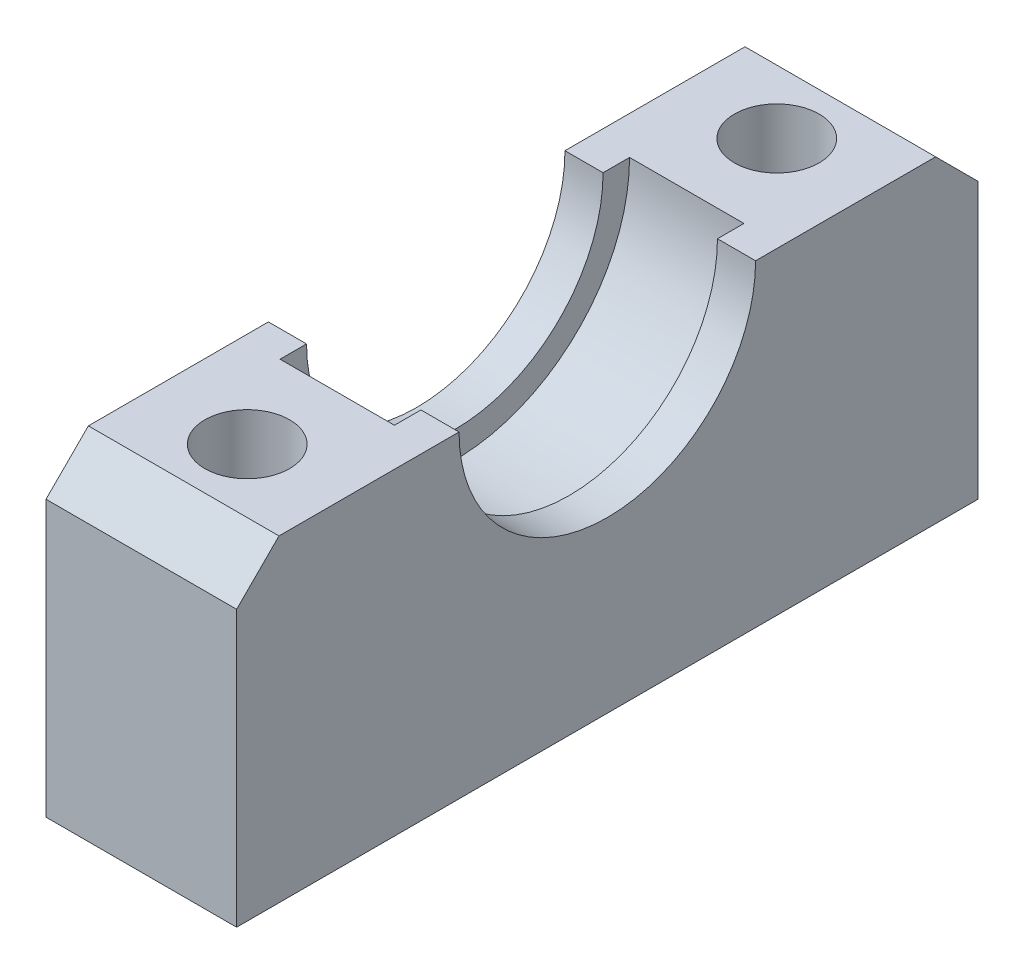
ISO-10303-21;
HEADER;
FILE_DESCRIPTION(('STEP AP214'),'2;1');
FILE_NAME('part.step','',(''),(''),'','','');
FILE_SCHEMA(('AUTOMOTIVE_DESIGN { 1 0 10303 214 1 1 1 1 }'));
ENDSEC;
DATA;
#1=APPLICATION_CONTEXT('core data for automotive mechanical design processes');
#2=APPLICATION_PROTOCOL_DEFINITION('international standard','automotive_design',2000,#1);
#3=PRODUCT_CONTEXT('',#1,'mechanical');
#4=PRODUCT('Part','Part','',(#3));
#5=PRODUCT_RELATED_PRODUCT_CATEGORY('part','',(#4));
#6=PRODUCT_DEFINITION_FORMATION('','',#4);
#7=PRODUCT_DEFINITION_CONTEXT('part definition',#1,'design');
#8=PRODUCT_DEFINITION('design','',#6,#7);
#9=PRODUCT_DEFINITION_SHAPE('','',#8);
#10=(LENGTH_UNIT() NAMED_UNIT(*) SI_UNIT(.MILLI.,.METRE.));
#11=(NAMED_UNIT(*) PLANE_ANGLE_UNIT() SI_UNIT($,.RADIAN.));
#12=(NAMED_UNIT(*) SI_UNIT($,.STERADIAN.) SOLID_ANGLE_UNIT());
#13=UNCERTAINTY_MEASURE_WITH_UNIT(LENGTH_MEASURE(1.E-05),#10,'distance_accuracy_value','');
#14=(GEOMETRIC_REPRESENTATION_CONTEXT(3) GLOBAL_UNCERTAINTY_ASSIGNED_CONTEXT((#13)) GLOBAL_UNIT_ASSIGNED_CONTEXT((#10,
#11,#12)) REPRESENTATION_CONTEXT('',''));
#15=CARTESIAN_POINT('',(0.,0.,0.));
#16=DIRECTION('',(0.,0.,1.));
#17=DIRECTION('',(1.,0.,0.));
#18=AXIS2_PLACEMENT_3D('',#15,#16,#17);
#19=CARTESIAN_POINT('',(-4.5,7.5,0.));
#20=DIRECTION('',(1.,0.,0.));
#21=DIRECTION('',(0.,0.,-1.));
#22=AXIS2_PLACEMENT_3D('',#19,#20,#21);
#23=CYLINDRICAL_SURFACE('',#22,7.);
#24=DIRECTION('',(1.,0.,0.));
#25=VECTOR('',#24,1.);
#26=CARTESIAN_POINT('',(-4.5,7.5,7.));
#27=LINE('',#26,#25);
#28=CARTESIAN_POINT('',(-4.5,7.5,7.));
#29=VERTEX_POINT('',#28);
#30=CARTESIAN_POINT('',(-2.7,7.5,7.));
#31=VERTEX_POINT('',#30);
#32=EDGE_CURVE('E222',#29,#31,#27,.T.);
#33=ORIENTED_EDGE('',*,*,#32,.T.);
#34=CARTESIAN_POINT('',(-2.7,7.5,0.));
#35=DIRECTION('',(1.,0.,0.));
#36=DIRECTION('',(0.,0.,-1.));
#37=AXIS2_PLACEMENT_3D('',#34,#35,#36);
#38=CIRCLE('',#37,7.);
#39=CARTESIAN_POINT('',(-2.7,7.5,-7.));
#40=VERTEX_POINT('',#39);
#41=EDGE_CURVE('E141',#31,#40,#38,.T.);
#42=ORIENTED_EDGE('',*,*,#41,.T.);
#43=DIRECTION('',(1.,0.,0.));
#44=VECTOR('',#43,1.);
#45=CARTESIAN_POINT('',(-4.5,7.5,-7.));
#46=LINE('',#45,#44);
#47=CARTESIAN_POINT('',(-4.5,7.5,-7.));
#48=VERTEX_POINT('',#47);
#49=EDGE_CURVE('E226',#48,#40,#46,.T.);
#50=ORIENTED_EDGE('',*,*,#49,.F.);
#51=CARTESIAN_POINT('',(-4.5,7.5,0.));
#52=DIRECTION('',(-1.,0.,0.));
#53=DIRECTION('',(0.,0.,-1.));
#54=AXIS2_PLACEMENT_3D('',#51,#52,#53);
#55=CIRCLE('',#54,7.);
#56=EDGE_CURVE('E199',#48,#29,#55,.T.);
#57=ORIENTED_EDGE('',*,*,#56,.T.);
#58=EDGE_LOOP('',(#33,#42,#50,#57));
#59=FACE_BOUND('',#58,.T.);
#60=ADVANCED_FACE('F45',(#59),#23,.F.);
#61=CARTESIAN_POINT('',(-4.5,-7.5,-17.5));
#62=DIRECTION('',(0.,0.,-1.));
#63=DIRECTION('',(-1.,0.,0.));
#64=AXIS2_PLACEMENT_3D('',#61,#62,#63);
#65=PLANE('',#64);
#66=DIRECTION('',(0.,1.,0.));
#67=VECTOR('',#66,1.);
#68=CARTESIAN_POINT('',(-4.5,-7.5,-17.5));
#69=LINE('',#68,#67);
#70=CARTESIAN_POINT('',(-4.5,-7.5,-17.5));
#71=VERTEX_POINT('',#70);
#72=CARTESIAN_POINT('',(-4.5,5.5,-17.5));
#73=VERTEX_POINT('',#72);
#74=EDGE_CURVE('E192',#71,#73,#69,.T.);
#75=ORIENTED_EDGE('',*,*,#74,.T.);
#76=DIRECTION('',(1.,0.,0.));
#77=VECTOR('',#76,1.);
#78=CARTESIAN_POINT('',(-4.5,5.5,-17.5));
#79=LINE('',#78,#77);
#80=CARTESIAN_POINT('',(4.5,5.5,-17.5));
#81=VERTEX_POINT('',#80);
#82=EDGE_CURVE('E237',#73,#81,#79,.T.);
#83=ORIENTED_EDGE('',*,*,#82,.T.);
#84=DIRECTION('',(0.,1.,0.));
#85=VECTOR('',#84,1.);
#86=CARTESIAN_POINT('',(4.5,-7.5,-17.5));
#87=LINE('',#86,#85);
#88=CARTESIAN_POINT('',(4.5,-7.5,-17.5));
#89=VERTEX_POINT('',#88);
#90=EDGE_CURVE('E165',#89,#81,#87,.T.);
#91=ORIENTED_EDGE('',*,*,#90,.F.);
#92=DIRECTION('',(1.,0.,0.));
#93=VECTOR('',#92,1.);
#94=CARTESIAN_POINT('',(-4.5,-7.5,-17.5));
#95=LINE('',#94,#93);
#96=EDGE_CURVE('E214',#71,#89,#95,.T.);
#97=ORIENTED_EDGE('',*,*,#96,.F.);
#98=EDGE_LOOP('',(#75,#83,#91,#97));
#99=FACE_BOUND('',#98,.T.);
#100=ADVANCED_FACE('F319',(#99),#65,.T.);
#101=CARTESIAN_POINT('',(-4.5,-7.5,17.5));
#102=DIRECTION('',(0.,-1.,0.));
#103=DIRECTION('',(0.,0.,-1.));
#104=AXIS2_PLACEMENT_3D('',#101,#102,#103);
#105=PLANE('',#104);
#106=CARTESIAN_POINT('',(0.,-7.5,-12.5));
#107=DIRECTION('',(0.,1.,0.));
#108=DIRECTION('',(0.,0.,1.));
#109=AXIS2_PLACEMENT_3D('',#106,#107,#108);
#110=CIRCLE('',#109,2.);
#111=CARTESIAN_POINT('',(0.,-7.5,-10.5));
#112=VERTEX_POINT('',#111);
#113=EDGE_CURVE('E158',#112,#112,#110,.T.);
#114=ORIENTED_EDGE('',*,*,#113,.T.);
#115=EDGE_LOOP('',(#114));
#116=FACE_BOUND('',#115,.T.);
#117=CARTESIAN_POINT('',(0.,-7.5,12.5));
#118=DIRECTION('',(0.,1.,0.));
#119=DIRECTION('',(0.,0.,1.));
#120=AXIS2_PLACEMENT_3D('',#117,#118,#119);
#121=CIRCLE('',#120,2.);
#122=CARTESIAN_POINT('',(0.,-7.5,14.5));
#123=VERTEX_POINT('',#122);
#124=EDGE_CURVE('E282',#123,#123,#121,.T.);
#125=ORIENTED_EDGE('',*,*,#124,.T.);
#126=EDGE_LOOP('',(#125));
#127=FACE_BOUND('',#126,.T.);
#128=ORIENTED_EDGE('',*,*,#96,.T.);
#129=DIRECTION('',(0.,0.,-1.));
#130=VECTOR('',#129,1.);
#131=CARTESIAN_POINT('',(4.5,-7.5,17.5));
#132=LINE('',#131,#130);
#133=CARTESIAN_POINT('',(4.5,-7.5,17.5));
#134=VERTEX_POINT('',#133);
#135=EDGE_CURVE('E188',#134,#89,#132,.T.);
#136=ORIENTED_EDGE('',*,*,#135,.F.);
#137=DIRECTION('',(1.,0.,0.));
#138=VECTOR('',#137,1.);
#139=CARTESIAN_POINT('',(-4.5,-7.5,17.5));
#140=LINE('',#139,#138);
#141=CARTESIAN_POINT('',(-4.5,-7.5,17.5));
#142=VERTEX_POINT('',#141);
#143=EDGE_CURVE('E218',#142,#134,#140,.T.);
#144=ORIENTED_EDGE('',*,*,#143,.F.);
#145=DIRECTION('',(0.,0.,-1.));
#146=VECTOR('',#145,1.);
#147=CARTESIAN_POINT('',(-4.5,-7.5,17.5));
#148=LINE('',#147,#146);
#149=EDGE_CURVE('E209',#142,#71,#148,.T.);
#150=ORIENTED_EDGE('',*,*,#149,.T.);
#151=EDGE_LOOP('',(#128,#136,#144,#150));
#152=FACE_BOUND('',#151,.T.);
#153=ADVANCED_FACE('F298',(#116,#127,#152),#105,.T.);
#154=CARTESIAN_POINT('',(-4.5,-7.5,17.5));
#155=DIRECTION('',(0.,0.,1.));
#156=DIRECTION('',(1.,0.,0.));
#157=AXIS2_PLACEMENT_3D('',#154,#155,#156);
#158=PLANE('',#157);
#159=DIRECTION('',(0.,-1.,0.));
#160=VECTOR('',#159,1.);
#161=CARTESIAN_POINT('',(4.5,-7.5,17.5));
#162=LINE('',#161,#160);
#163=CARTESIAN_POINT('',(4.5,5.49999999999999,17.5));
#164=VERTEX_POINT('',#163);
#165=EDGE_CURVE('E185',#164,#134,#162,.T.);
#166=ORIENTED_EDGE('',*,*,#165,.F.);
#167=DIRECTION('',(-1.,0.,0.));
#168=VECTOR('',#167,1.);
#169=CARTESIAN_POINT('',(-4.5,5.49999999999999,17.5));
#170=LINE('',#169,#168);
#171=CARTESIAN_POINT('',(-4.5,5.49999999999999,17.5));
#172=VERTEX_POINT('',#171);
#173=EDGE_CURVE('E11',#164,#172,#170,.T.);
#174=ORIENTED_EDGE('',*,*,#173,.T.);
#175=DIRECTION('',(0.,-1.,0.));
#176=VECTOR('',#175,1.);
#177=CARTESIAN_POINT('',(-4.5,-7.5,17.5));
#178=LINE('',#177,#176);
#179=EDGE_CURVE('E206',#172,#142,#178,.T.);
#180=ORIENTED_EDGE('',*,*,#179,.T.);
#181=ORIENTED_EDGE('',*,*,#143,.T.);
#182=EDGE_LOOP('',(#166,#174,#180,#181));
#183=FACE_BOUND('',#182,.T.);
#184=ADVANCED_FACE('F328',(#183),#158,.T.);
#185=CARTESIAN_POINT('',(-4.5,7.5,17.5));
#186=DIRECTION('',(0.,1.,0.));
#187=DIRECTION('',(0.,0.,1.));
#188=AXIS2_PLACEMENT_3D('',#185,#186,#187);
#189=PLANE('',#188);
#190=CARTESIAN_POINT('',(0.,7.5,12.5));
#191=DIRECTION('',(0.,1.,0.));
#192=DIRECTION('',(0.,0.,1.));
#193=AXIS2_PLACEMENT_3D('',#190,#191,#192);
#194=CIRCLE('',#193,2.);
#195=CARTESIAN_POINT('',(0.,7.5,14.5));
#196=VERTEX_POINT('',#195);
#197=EDGE_CURVE('E286',#196,#196,#194,.T.);
#198=ORIENTED_EDGE('',*,*,#197,.F.);
#199=EDGE_LOOP('',(#198));
#200=FACE_BOUND('',#199,.T.);
#201=DIRECTION('',(0.,0.,1.));
#202=VECTOR('',#201,1.);
#203=CARTESIAN_POINT('',(-4.5,7.5,17.5));
#204=LINE('',#203,#202);
#205=CARTESIAN_POINT('',(-4.5,7.5,15.5));
#206=VERTEX_POINT('',#205);
#207=EDGE_CURVE('E203',#29,#206,#204,.T.);
#208=ORIENTED_EDGE('',*,*,#207,.T.);
#209=DIRECTION('',(1.,0.,0.));
#210=VECTOR('',#209,1.);
#211=CARTESIAN_POINT('',(-4.5,7.5,15.5));
#212=LINE('',#211,#210);
#213=CARTESIAN_POINT('',(4.5,7.5,15.5));
#214=VERTEX_POINT('',#213);
#215=EDGE_CURVE('E55',#206,#214,#212,.T.);
#216=ORIENTED_EDGE('',*,*,#215,.T.);
#217=DIRECTION('',(0.,0.,1.));
#218=VECTOR('',#217,1.);
#219=CARTESIAN_POINT('',(4.5,7.5,17.5));
#220=LINE('',#219,#218);
#221=CARTESIAN_POINT('',(4.5,7.5,7.));
#222=VERTEX_POINT('',#221);
#223=EDGE_CURVE('E181',#222,#214,#220,.T.);
#224=ORIENTED_EDGE('',*,*,#223,.F.);
#225=CARTESIAN_POINT('',(2.7,7.5,7.));
#226=VERTEX_POINT('',#225);
#227=EDGE_CURVE('E225',#226,#222,#27,.T.);
#228=ORIENTED_EDGE('',*,*,#227,.F.);
#229=DIRECTION('',(0.,0.,-1.));
#230=VECTOR('',#229,1.);
#231=CARTESIAN_POINT('',(2.7,7.5,17.5));
#232=LINE('',#231,#230);
#233=CARTESIAN_POINT('',(2.7,7.5,8.25));
#234=VERTEX_POINT('',#233);
#235=EDGE_CURVE('E163',#234,#226,#232,.T.);
#236=ORIENTED_EDGE('',*,*,#235,.F.);
#237=DIRECTION('',(-1.,0.,0.));
#238=VECTOR('',#237,1.);
#239=CARTESIAN_POINT('',(2.7,7.5,8.25));
#240=LINE('',#239,#238);
#241=CARTESIAN_POINT('',(-2.7,7.5,8.25));
#242=VERTEX_POINT('',#241);
#243=EDGE_CURVE('E151',#234,#242,#240,.T.);
#244=ORIENTED_EDGE('',*,*,#243,.T.);
#245=DIRECTION('',(0.,0.,-1.));
#246=VECTOR('',#245,1.);
#247=CARTESIAN_POINT('',(-2.7,7.5,17.5));
#248=LINE('',#247,#246);
#249=EDGE_CURVE('E135',#242,#31,#248,.T.);
#250=ORIENTED_EDGE('',*,*,#249,.T.);
#251=ORIENTED_EDGE('',*,*,#32,.F.);
#252=EDGE_LOOP('',(#208,#216,#224,#228,#236,#244,#250,#251));
#253=FACE_BOUND('',#252,.T.);
#254=ADVANCED_FACE('F161',(#200,#253),#189,.T.);
#255=CARTESIAN_POINT('',(2.7,7.5,0.));
#256=DIRECTION('',(1.,0.,0.));
#257=DIRECTION('',(0.,0.,-1.));
#258=AXIS2_PLACEMENT_3D('',#255,#256,#257);
#259=CIRCLE('',#258,7.);
#260=CARTESIAN_POINT('',(2.7,7.5,-7.));
#261=VERTEX_POINT('',#260);
#262=EDGE_CURVE('E146',#226,#261,#259,.T.);
#263=ORIENTED_EDGE('',*,*,#262,.F.);
#264=ORIENTED_EDGE('',*,*,#227,.T.);
#265=CARTESIAN_POINT('',(4.5,7.5,0.));
#266=DIRECTION('',(-1.,0.,0.));
#267=DIRECTION('',(0.,0.,-1.));
#268=AXIS2_PLACEMENT_3D('',#265,#266,#267);
#269=CIRCLE('',#268,7.);
#270=CARTESIAN_POINT('',(4.5,7.5,-7.));
#271=VERTEX_POINT('',#270);
#272=EDGE_CURVE('E177',#271,#222,#269,.T.);
#273=ORIENTED_EDGE('',*,*,#272,.F.);
#274=EDGE_CURVE('E213',#261,#271,#46,.T.);
#275=ORIENTED_EDGE('',*,*,#274,.F.);
#276=EDGE_LOOP('',(#263,#264,#273,#275));
#277=FACE_BOUND('',#276,.T.);
#278=ADVANCED_FACE('F267',(#277),#23,.F.);
#279=CARTESIAN_POINT('',(-4.5,7.5,-7.));
#280=DIRECTION('',(0.,1.,0.));
#281=DIRECTION('',(0.,0.,1.));
#282=AXIS2_PLACEMENT_3D('',#279,#280,#281);
#283=PLANE('',#282);
#284=CARTESIAN_POINT('',(0.,7.5,-12.5));
#285=DIRECTION('',(0.,1.,0.));
#286=DIRECTION('',(0.,0.,1.));
#287=AXIS2_PLACEMENT_3D('',#284,#285,#286);
#288=CIRCLE('',#287,2.);
#289=CARTESIAN_POINT('',(0.,7.5,-10.5));
#290=VERTEX_POINT('',#289);
#291=EDGE_CURVE('E290',#290,#290,#288,.T.);
#292=ORIENTED_EDGE('',*,*,#291,.F.);
#293=EDGE_LOOP('',(#292));
#294=FACE_BOUND('',#293,.T.);
#295=DIRECTION('',(0.,0.,1.));
#296=VECTOR('',#295,1.);
#297=CARTESIAN_POINT('',(4.5,7.5,-7.));
#298=LINE('',#297,#296);
#299=CARTESIAN_POINT('',(4.5,7.5,-15.5));
#300=VERTEX_POINT('',#299);
#301=EDGE_CURVE('E170',#300,#271,#298,.T.);
#302=ORIENTED_EDGE('',*,*,#301,.F.);
#303=DIRECTION('',(-1.,0.,0.));
#304=VECTOR('',#303,1.);
#305=CARTESIAN_POINT('',(-4.5,7.5,-15.5));
#306=LINE('',#305,#304);
#307=CARTESIAN_POINT('',(-4.5,7.5,-15.5));
#308=VERTEX_POINT('',#307);
#309=EDGE_CURVE('E247',#300,#308,#306,.T.);
#310=ORIENTED_EDGE('',*,*,#309,.T.);
#311=DIRECTION('',(0.,0.,1.));
#312=VECTOR('',#311,1.);
#313=CARTESIAN_POINT('',(-4.5,7.5,-7.));
#314=LINE('',#313,#312);
#315=EDGE_CURVE('E196',#308,#48,#314,.T.);
#316=ORIENTED_EDGE('',*,*,#315,.T.);
#317=ORIENTED_EDGE('',*,*,#49,.T.);
#318=DIRECTION('',(0.,0.,-1.));
#319=VECTOR('',#318,1.);
#320=CARTESIAN_POINT('',(-2.7,7.5,-7.));
#321=LINE('',#320,#319);
#322=CARTESIAN_POINT('',(-2.7,7.5,-8.25));
#323=VERTEX_POINT('',#322);
#324=EDGE_CURVE('E217',#40,#323,#321,.T.);
#325=ORIENTED_EDGE('',*,*,#324,.T.);
#326=DIRECTION('',(-1.,0.,0.));
#327=VECTOR('',#326,1.);
#328=CARTESIAN_POINT('',(2.7,7.5,-8.25));
#329=LINE('',#328,#327);
#330=CARTESIAN_POINT('',(2.7,7.5,-8.25));
#331=VERTEX_POINT('',#330);
#332=EDGE_CURVE('E154',#323,#331,#329,.F.);
#333=ORIENTED_EDGE('',*,*,#332,.T.);
#334=DIRECTION('',(0.,0.,-1.));
#335=VECTOR('',#334,1.);
#336=CARTESIAN_POINT('',(2.7,7.5,-7.));
#337=LINE('',#336,#335);
#338=EDGE_CURVE('E234',#261,#331,#337,.T.);
#339=ORIENTED_EDGE('',*,*,#338,.F.);
#340=ORIENTED_EDGE('',*,*,#274,.T.);
#341=EDGE_LOOP('',(#302,#310,#316,#317,#325,#333,#339,#340));
#342=FACE_BOUND('',#341,.T.);
#343=ADVANCED_FACE('F272',(#294,#342),#283,.T.);
#344=CARTESIAN_POINT('',(-4.5,7.5,0.));
#345=DIRECTION('',(1.,0.,0.));
#346=DIRECTION('',(0.,0.,-1.));
#347=AXIS2_PLACEMENT_3D('',#344,#345,#346);
#348=PLANE('',#347);
#349=ORIENTED_EDGE('',*,*,#315,.F.);
#350=DIRECTION('',(0.,0.707106781186546,0.707106781186549));
#351=VECTOR('',#350,1.);
#352=CARTESIAN_POINT('',(-4.5,5.5,-17.5));
#353=LINE('',#352,#351);
#354=EDGE_CURVE('E252',#308,#73,#353,.F.);
#355=ORIENTED_EDGE('',*,*,#354,.T.);
#356=ORIENTED_EDGE('',*,*,#74,.F.);
#357=ORIENTED_EDGE('',*,*,#149,.F.);
#358=ORIENTED_EDGE('',*,*,#179,.F.);
#359=DIRECTION('',(0.,-0.707106781186549,0.707106781186546));
#360=VECTOR('',#359,1.);
#361=CARTESIAN_POINT('',(-4.5,7.5,15.5));
#362=LINE('',#361,#360);
#363=EDGE_CURVE('E62',#172,#206,#362,.F.);
#364=ORIENTED_EDGE('',*,*,#363,.T.);
#365=ORIENTED_EDGE('',*,*,#207,.F.);
#366=ORIENTED_EDGE('',*,*,#56,.F.);
#367=EDGE_LOOP('',(#349,#355,#356,#357,#358,#364,#365,#366));
#368=FACE_BOUND('',#367,.T.);
#369=ADVANCED_FACE('F309',(#368),#348,.F.);
#370=CARTESIAN_POINT('',(4.5,7.5,0.));
#371=DIRECTION('',(1.,0.,0.));
#372=DIRECTION('',(0.,0.,-1.));
#373=AXIS2_PLACEMENT_3D('',#370,#371,#372);
#374=PLANE('',#373);
#375=ORIENTED_EDGE('',*,*,#90,.T.);
#376=DIRECTION('',(0.,-0.707106781186546,-0.707106781186549));
#377=VECTOR('',#376,1.);
#378=CARTESIAN_POINT('',(4.5,15.25,-7.74999999999996));
#379=LINE('',#378,#377);
#380=EDGE_CURVE('E244',#81,#300,#379,.F.);
#381=ORIENTED_EDGE('',*,*,#380,.T.);
#382=ORIENTED_EDGE('',*,*,#301,.T.);
#383=ORIENTED_EDGE('',*,*,#272,.T.);
#384=ORIENTED_EDGE('',*,*,#223,.T.);
#385=DIRECTION('',(0.,0.707106781186549,-0.707106781186546));
#386=VECTOR('',#385,1.);
#387=CARTESIAN_POINT('',(4.5,15.25,7.75000000000004));
#388=LINE('',#387,#386);
#389=EDGE_CURVE('E241',#214,#164,#388,.F.);
#390=ORIENTED_EDGE('',*,*,#389,.T.);
#391=ORIENTED_EDGE('',*,*,#165,.T.);
#392=ORIENTED_EDGE('',*,*,#135,.T.);
#393=EDGE_LOOP('',(#375,#381,#382,#383,#384,#390,#391,#392));
#394=FACE_BOUND('',#393,.T.);
#395=ADVANCED_FACE('F260',(#394),#374,.T.);
#396=CARTESIAN_POINT('',(2.7,7.5,0.));
#397=DIRECTION('',(-1.,0.,0.));
#398=DIRECTION('',(0.,0.,1.));
#399=AXIS2_PLACEMENT_3D('',#396,#397,#398);
#400=CYLINDRICAL_SURFACE('',#399,8.25);
#401=CARTESIAN_POINT('',(2.7,7.5,0.));
#402=DIRECTION('',(1.,0.,0.));
#403=DIRECTION('',(0.,0.,-1.));
#404=AXIS2_PLACEMENT_3D('',#401,#402,#403);
#405=CIRCLE('',#404,8.25);
#406=EDGE_CURVE('E157',#234,#331,#405,.T.);
#407=ORIENTED_EDGE('',*,*,#406,.T.);
#408=ORIENTED_EDGE('',*,*,#332,.F.);
#409=CARTESIAN_POINT('',(-2.7,7.5,0.));
#410=DIRECTION('',(1.,0.,0.));
#411=DIRECTION('',(0.,0.,-1.));
#412=AXIS2_PLACEMENT_3D('',#409,#410,#411);
#413=CIRCLE('',#412,8.25);
#414=EDGE_CURVE('E138',#242,#323,#413,.T.);
#415=ORIENTED_EDGE('',*,*,#414,.F.);
#416=ORIENTED_EDGE('',*,*,#243,.F.);
#417=EDGE_LOOP('',(#407,#408,#415,#416));
#418=FACE_BOUND('',#417,.T.);
#419=ADVANCED_FACE('F150',(#418),#400,.F.);
#420=CARTESIAN_POINT('',(2.7,7.5,0.));
#421=DIRECTION('',(1.,0.,0.));
#422=DIRECTION('',(0.,0.,-1.));
#423=AXIS2_PLACEMENT_3D('',#420,#421,#422);
#424=PLANE('',#423);
#425=ORIENTED_EDGE('',*,*,#235,.T.);
#426=ORIENTED_EDGE('',*,*,#262,.T.);
#427=ORIENTED_EDGE('',*,*,#338,.T.);
#428=ORIENTED_EDGE('',*,*,#406,.F.);
#429=EDGE_LOOP('',(#425,#426,#427,#428));
#430=FACE_BOUND('',#429,.T.);
#431=ADVANCED_FACE('F275',(#430),#424,.F.);
#432=CARTESIAN_POINT('',(-2.7,7.5,0.));
#433=DIRECTION('',(1.,0.,0.));
#434=DIRECTION('',(0.,0.,-1.));
#435=AXIS2_PLACEMENT_3D('',#432,#433,#434);
#436=PLANE('',#435);
#437=ORIENTED_EDGE('',*,*,#414,.T.);
#438=ORIENTED_EDGE('',*,*,#324,.F.);
#439=ORIENTED_EDGE('',*,*,#41,.F.);
#440=ORIENTED_EDGE('',*,*,#249,.F.);
#441=EDGE_LOOP('',(#437,#438,#439,#440));
#442=FACE_BOUND('',#441,.T.);
#443=ADVANCED_FACE('F137',(#442),#436,.T.);
#444=CARTESIAN_POINT('',(0.,-7.5,-12.5));
#445=DIRECTION('',(0.,1.,0.));
#446=DIRECTION('',(0.,0.,1.));
#447=AXIS2_PLACEMENT_3D('',#444,#445,#446);
#448=CYLINDRICAL_SURFACE('',#447,2.);
#449=ORIENTED_EDGE('',*,*,#113,.F.);
#450=EDGE_LOOP('',(#449));
#451=FACE_BOUND('',#450,.T.);
#452=ORIENTED_EDGE('',*,*,#291,.T.);
#453=EDGE_LOOP('',(#452));
#454=FACE_BOUND('',#453,.T.);
#455=ADVANCED_FACE('F301',(#451,#454),#448,.F.);
#456=CARTESIAN_POINT('',(0.,-7.5,12.5));
#457=DIRECTION('',(0.,1.,0.));
#458=DIRECTION('',(0.,0.,1.));
#459=AXIS2_PLACEMENT_3D('',#456,#457,#458);
#460=CYLINDRICAL_SURFACE('',#459,2.);
#461=ORIENTED_EDGE('',*,*,#124,.F.);
#462=EDGE_LOOP('',(#461));
#463=FACE_BOUND('',#462,.T.);
#464=ORIENTED_EDGE('',*,*,#197,.T.);
#465=EDGE_LOOP('',(#464));
#466=FACE_BOUND('',#465,.T.);
#467=ADVANCED_FACE('F304',(#463,#466),#460,.F.);
#468=CARTESIAN_POINT('',(-4.5,5.5,-17.5));
#469=DIRECTION('',(0.,-0.707106781186549,0.707106781186546));
#470=DIRECTION('',(1.,0.,0.));
#471=AXIS2_PLACEMENT_3D('',#468,#469,#470);
#472=PLANE('',#471);
#473=ORIENTED_EDGE('',*,*,#354,.F.);
#474=ORIENTED_EDGE('',*,*,#309,.F.);
#475=ORIENTED_EDGE('',*,*,#380,.F.);
#476=ORIENTED_EDGE('',*,*,#82,.F.);
#477=EDGE_LOOP('',(#473,#474,#475,#476));
#478=FACE_BOUND('',#477,.T.);
#479=ADVANCED_FACE('F343',(#478),#472,.F.);
#480=CARTESIAN_POINT('',(-4.5,7.5,15.5));
#481=DIRECTION('',(0.,-0.707106781186546,-0.707106781186549));
#482=DIRECTION('',(1.,0.,0.));
#483=AXIS2_PLACEMENT_3D('',#480,#481,#482);
#484=PLANE('',#483);
#485=ORIENTED_EDGE('',*,*,#363,.F.);
#486=ORIENTED_EDGE('',*,*,#173,.F.);
#487=ORIENTED_EDGE('',*,*,#389,.F.);
#488=ORIENTED_EDGE('',*,*,#215,.F.);
#489=EDGE_LOOP('',(#485,#486,#487,#488));
#490=FACE_BOUND('',#489,.T.);
#491=ADVANCED_FACE('F48',(#490),#484,.F.);
#492=CLOSED_SHELL('',(#60,#100,#153,#184,#254,#278,#343,#369,#395,#419,#431,#443,#455,#467,#479,#491));
#493=MANIFOLD_SOLID_BREP('B2',#492);
#494=ADVANCED_BREP_SHAPE_REPRESENTATION('',(#18,#493),#14);
#495=SHAPE_DEFINITION_REPRESENTATION(#9,#494);
ENDSEC;
END-ISO-10303-21;
